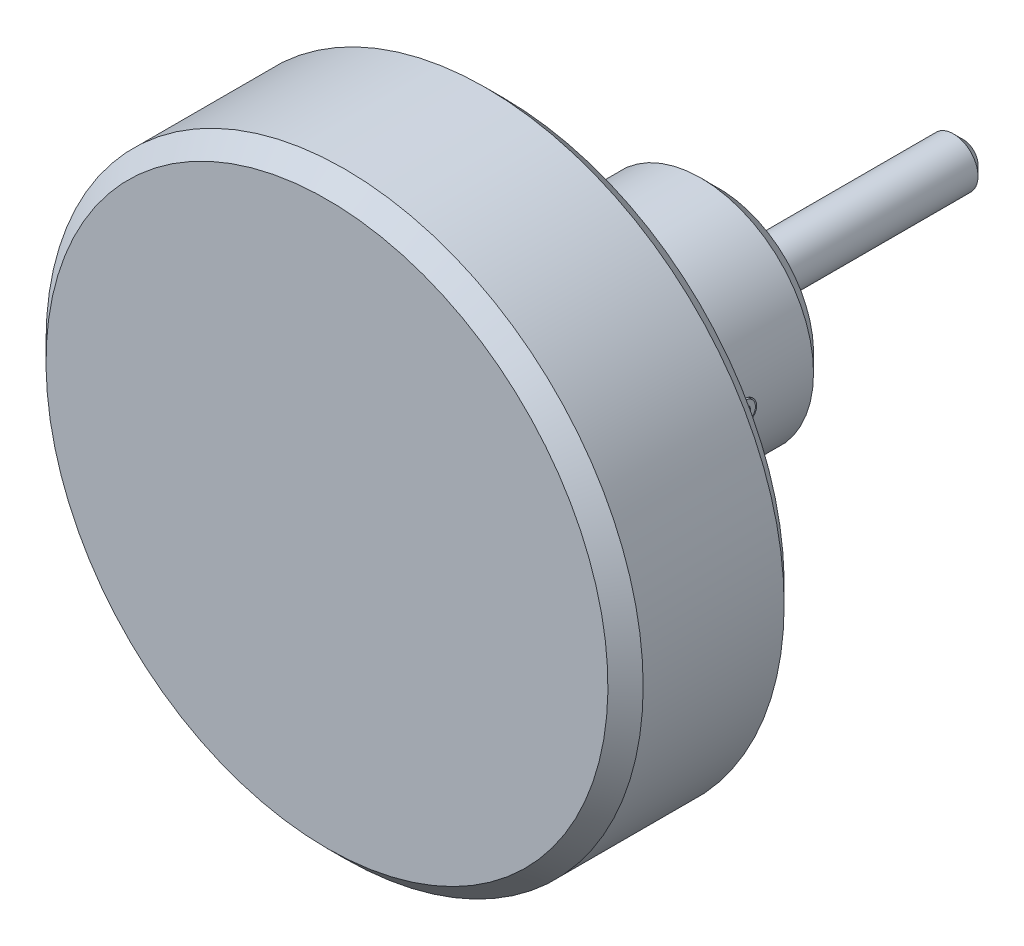
ISO-10303-21;
HEADER;
FILE_DESCRIPTION(('STEP AP214'),'2;1');
FILE_NAME('part.step','',(''),(''),'','','');
FILE_SCHEMA(('AUTOMOTIVE_DESIGN { 1 0 10303 214 1 1 1 1 }'));
ENDSEC;
DATA;
#1=APPLICATION_CONTEXT('core data for automotive mechanical design processes');
#2=APPLICATION_PROTOCOL_DEFINITION('international standard','automotive_design',2000,#1);
#3=PRODUCT_CONTEXT('',#1,'mechanical');
#4=PRODUCT('Part','Part','',(#3));
#5=PRODUCT_RELATED_PRODUCT_CATEGORY('part','',(#4));
#6=PRODUCT_DEFINITION_FORMATION('','',#4);
#7=PRODUCT_DEFINITION_CONTEXT('part definition',#1,'design');
#8=PRODUCT_DEFINITION('design','',#6,#7);
#9=PRODUCT_DEFINITION_SHAPE('','',#8);
#10=(LENGTH_UNIT() NAMED_UNIT(*) SI_UNIT(.MILLI.,.METRE.));
#11=(NAMED_UNIT(*) PLANE_ANGLE_UNIT() SI_UNIT($,.RADIAN.));
#12=(NAMED_UNIT(*) SI_UNIT($,.STERADIAN.) SOLID_ANGLE_UNIT());
#13=UNCERTAINTY_MEASURE_WITH_UNIT(LENGTH_MEASURE(1.E-05),#10,'distance_accuracy_value','');
#14=(GEOMETRIC_REPRESENTATION_CONTEXT(3) GLOBAL_UNCERTAINTY_ASSIGNED_CONTEXT((#13)) GLOBAL_UNIT_ASSIGNED_CONTEXT((#10,
#11,#12)) REPRESENTATION_CONTEXT('',''));
#15=CARTESIAN_POINT('',(0.,0.,0.));
#16=DIRECTION('',(0.,0.,1.));
#17=DIRECTION('',(1.,0.,0.));
#18=AXIS2_PLACEMENT_3D('',#15,#16,#17);
#19=CARTESIAN_POINT('',(11.5,-0.531816960175001,21.1323187565515));
#20=DIRECTION('',(1.,0.,0.));
#21=DIRECTION('',(0.,1.,0.));
#22=AXIS2_PLACEMENT_3D('',#19,#20,#21);
#23=PLANE('',#22);
#24=CARTESIAN_POINT('',(11.5,0.,21.3));
#25=DIRECTION('',(1.,0.,0.));
#26=DIRECTION('',(0.,1.,0.));
#27=AXIS2_PLACEMENT_3D('',#24,#25,#26);
#28=CIRCLE('',#27,1.06562557198734);
#29=CARTESIAN_POINT('',(11.5,-1.0163051711551,20.9795602104034));
#30=VERTEX_POINT('',#29);
#31=CARTESIAN_POINT('',(11.5,-1.0163051711551,21.6204397895966));
#32=VERTEX_POINT('',#31);
#33=EDGE_CURVE('E12',#30,#32,#28,.T.);
#34=ORIENTED_EDGE('',*,*,#33,.T.);
#35=DIRECTION('',(0.,-0.953716950748229,0.300705799504267));
#36=VECTOR('',#35,1.);
#37=CARTESIAN_POINT('',(11.5,-0.531816960174998,21.4676812434485));
#38=LINE('',#37,#36);
#39=CARTESIAN_POINT('',(11.5,-0.531816960174998,21.4676812434485));
#40=VERTEX_POINT('',#39);
#41=EDGE_CURVE('E111',#40,#32,#38,.T.);
#42=ORIENTED_EDGE('',*,*,#41,.F.);
#43=CARTESIAN_POINT('',(11.5,0.,21.3));
#44=DIRECTION('',(1.,0.,0.));
#45=DIRECTION('',(0.,1.,0.));
#46=AXIS2_PLACEMENT_3D('',#43,#44,#45);
#47=CIRCLE('',#46,0.557625571987339);
#48=CARTESIAN_POINT('',(11.5,-0.531816960175001,21.1323187565515));
#49=VERTEX_POINT('',#48);
#50=EDGE_CURVE('E62',#49,#40,#47,.T.);
#51=ORIENTED_EDGE('',*,*,#50,.F.);
#52=DIRECTION('',(0.,-0.953716950748229,-0.300705799504267));
#53=VECTOR('',#52,1.);
#54=CARTESIAN_POINT('',(11.5,-0.531816960175001,21.1323187565515));
#55=LINE('',#54,#53);
#56=EDGE_CURVE('E113',#49,#30,#55,.T.);
#57=ORIENTED_EDGE('',*,*,#56,.T.);
#58=EDGE_LOOP('',(#34,#42,#51,#57));
#59=FACE_BOUND('',#58,.T.);
#60=ADVANCED_FACE('F47',(#59),#23,.T.);
#61=CARTESIAN_POINT('',(11.5,0.,21.3));
#62=DIRECTION('',(-1.,0.,0.));
#63=DIRECTION('',(0.,-1.,0.));
#64=AXIS2_PLACEMENT_3D('',#61,#62,#63);
#65=CONICAL_SURFACE('',#64,1.06562557198734,0.0872664625997154);
#66=CARTESIAN_POINT('',(10.07125,0.,21.3));
#67=DIRECTION('',(1.,0.,0.));
#68=DIRECTION('',(0.,1.,0.));
#69=AXIS2_PLACEMENT_3D('',#66,#67,#68);
#70=CIRCLE('',#69,1.190625);
#71=CARTESIAN_POINT('',(10.07125,-1.13551924448461,20.9419721574652));
#72=VERTEX_POINT('',#71);
#73=CARTESIAN_POINT('',(10.07125,-1.13551924448461,21.6580278425348));
#74=VERTEX_POINT('',#73);
#75=EDGE_CURVE('E55',#72,#74,#70,.T.);
#76=ORIENTED_EDGE('',*,*,#75,.T.);
#77=DIRECTION('',(-0.996194698091746,-0.0831219092134939,0.0262082373043228));
#78=VECTOR('',#77,1.);
#79=CARTESIAN_POINT('',(11.5,-1.0163051711551,21.6204397895966));
#80=LINE('',#79,#78);
#81=EDGE_CURVE('E122',#32,#74,#80,.T.);
#82=ORIENTED_EDGE('',*,*,#81,.F.);
#83=ORIENTED_EDGE('',*,*,#33,.F.);
#84=DIRECTION('',(-0.996194698091746,-0.0831219092134939,-0.0262082373043228));
#85=VECTOR('',#84,1.);
#86=CARTESIAN_POINT('',(11.5,-1.0163051711551,20.9795602104034));
#87=LINE('',#86,#85);
#88=EDGE_CURVE('E144',#30,#72,#87,.T.);
#89=ORIENTED_EDGE('',*,*,#88,.T.);
#90=EDGE_LOOP('',(#76,#82,#83,#89));
#91=FACE_BOUND('',#90,.T.);
#92=ADVANCED_FACE('F49',(#91),#65,.T.);
#93=CARTESIAN_POINT('',(11.5,0.,21.3));
#94=DIRECTION('',(1.,0.,0.));
#95=DIRECTION('',(0.,1.,0.));
#96=AXIS2_PLACEMENT_3D('',#93,#94,#95);
#97=CYLINDRICAL_SURFACE('',#96,1.190625);
#98=CARTESIAN_POINT('',(3.40375,0.,21.3));
#99=DIRECTION('',(1.,0.,0.));
#100=DIRECTION('',(0.,1.,0.));
#101=AXIS2_PLACEMENT_3D('',#98,#99,#100);
#102=CIRCLE('',#101,1.190625);
#103=CARTESIAN_POINT('',(3.40375,-1.13551924448461,20.9419721574652));
#104=VERTEX_POINT('',#103);
#105=CARTESIAN_POINT('',(3.40375,-1.13551924448461,21.6580278425348));
#106=VERTEX_POINT('',#105);
#107=EDGE_CURVE('E170',#104,#106,#102,.T.);
#108=ORIENTED_EDGE('',*,*,#107,.T.);
#109=DIRECTION('',(-1.,0.,0.));
#110=VECTOR('',#109,1.);
#111=CARTESIAN_POINT('',(10.07125,-1.13551924448461,21.6580278425348));
#112=LINE('',#111,#110);
#113=EDGE_CURVE('E127',#74,#106,#112,.T.);
#114=ORIENTED_EDGE('',*,*,#113,.F.);
#115=ORIENTED_EDGE('',*,*,#75,.F.);
#116=DIRECTION('',(-1.,0.,0.));
#117=VECTOR('',#116,1.);
#118=CARTESIAN_POINT('',(10.07125,-1.13551924448461,20.9419721574652));
#119=LINE('',#118,#117);
#120=EDGE_CURVE('E146',#72,#104,#119,.T.);
#121=ORIENTED_EDGE('',*,*,#120,.T.);
#122=EDGE_LOOP('',(#108,#114,#115,#121));
#123=FACE_BOUND('',#122,.T.);
#124=ADVANCED_FACE('F172',(#123),#97,.T.);
#125=CARTESIAN_POINT('',(3.40375,0.,21.3));
#126=DIRECTION('',(1.,0.,0.));
#127=DIRECTION('',(0.,1.,0.));
#128=AXIS2_PLACEMENT_3D('',#125,#126,#127);
#129=CONICAL_SURFACE('',#128,1.190625,0.0872664625997158);
#130=CARTESIAN_POINT('',(1.975,0.,21.3));
#131=DIRECTION('',(1.,0.,0.));
#132=DIRECTION('',(0.,1.,0.));
#133=AXIS2_PLACEMENT_3D('',#130,#131,#132);
#134=CIRCLE('',#133,1.06562557198734);
#135=CARTESIAN_POINT('',(1.975,-1.0163051711551,20.9795602104034));
#136=VERTEX_POINT('',#135);
#137=CARTESIAN_POINT('',(1.975,-1.0163051711551,21.6204397895966));
#138=VERTEX_POINT('',#137);
#139=EDGE_CURVE('E168',#136,#138,#134,.T.);
#140=ORIENTED_EDGE('',*,*,#139,.T.);
#141=DIRECTION('',(-0.996194698091746,0.0831219092134933,-0.0262082373043227));
#142=VECTOR('',#141,1.);
#143=CARTESIAN_POINT('',(3.40375,-1.13551924448461,21.6580278425348));
#144=LINE('',#143,#142);
#145=EDGE_CURVE('E129',#106,#138,#144,.T.);
#146=ORIENTED_EDGE('',*,*,#145,.F.);
#147=ORIENTED_EDGE('',*,*,#107,.F.);
#148=DIRECTION('',(-0.996194698091746,0.0831219092134933,0.0262082373043227));
#149=VECTOR('',#148,1.);
#150=CARTESIAN_POINT('',(3.40375,-1.13551924448461,20.9419721574652));
#151=LINE('',#150,#149);
#152=EDGE_CURVE('E149',#104,#136,#151,.T.);
#153=ORIENTED_EDGE('',*,*,#152,.T.);
#154=EDGE_LOOP('',(#140,#146,#147,#153));
#155=FACE_BOUND('',#154,.T.);
#156=ADVANCED_FACE('F178',(#155),#129,.T.);
#157=CARTESIAN_POINT('',(1.975,-1.0163051711551,20.9795602104034));
#158=DIRECTION('',(-1.,0.,0.));
#159=DIRECTION('',(0.,-1.,0.));
#160=AXIS2_PLACEMENT_3D('',#157,#158,#159);
#161=PLANE('',#160);
#162=CARTESIAN_POINT('',(1.975,0.,21.3));
#163=DIRECTION('',(1.,0.,0.));
#164=DIRECTION('',(0.,1.,0.));
#165=AXIS2_PLACEMENT_3D('',#162,#163,#164);
#166=CIRCLE('',#165,0.557625571987339);
#167=CARTESIAN_POINT('',(1.975,-0.531816960175003,21.1323187565515));
#168=VERTEX_POINT('',#167);
#169=CARTESIAN_POINT('',(1.975,-0.531816960175,21.4676812434485));
#170=VERTEX_POINT('',#169);
#171=EDGE_CURVE('E166',#168,#170,#166,.T.);
#172=ORIENTED_EDGE('',*,*,#171,.T.);
#173=DIRECTION('',(0.,0.953716950748229,-0.300705799504267));
#174=VECTOR('',#173,1.);
#175=CARTESIAN_POINT('',(1.975,-1.0163051711551,21.6204397895966));
#176=LINE('',#175,#174);
#177=EDGE_CURVE('E134',#138,#170,#176,.T.);
#178=ORIENTED_EDGE('',*,*,#177,.F.);
#179=ORIENTED_EDGE('',*,*,#139,.F.);
#180=DIRECTION('',(0.,0.953716950748229,0.300705799504267));
#181=VECTOR('',#180,1.);
#182=CARTESIAN_POINT('',(1.975,-1.0163051711551,20.9795602104034));
#183=LINE('',#182,#181);
#184=EDGE_CURVE('E152',#136,#168,#183,.T.);
#185=ORIENTED_EDGE('',*,*,#184,.T.);
#186=EDGE_LOOP('',(#172,#178,#179,#185));
#187=FACE_BOUND('',#186,.T.);
#188=ADVANCED_FACE('F181',(#187),#161,.T.);
#189=CARTESIAN_POINT('',(1.975,0.,21.3));
#190=DIRECTION('',(1.,0.,0.));
#191=DIRECTION('',(0.,1.,0.));
#192=AXIS2_PLACEMENT_3D('',#189,#190,#191);
#193=CONICAL_SURFACE('',#192,0.557625571987339,0.0872664625997164);
#194=CARTESIAN_POINT('',(3.40374999999999,0.,21.3));
#195=DIRECTION('',(1.,0.,0.));
#196=DIRECTION('',(0.,1.,0.));
#197=AXIS2_PLACEMENT_3D('',#194,#195,#196);
#198=CIRCLE('',#197,0.682625000000002);
#199=CARTESIAN_POINT('',(3.40374999999999,-0.651031033504513,21.0947307036134));
#200=VERTEX_POINT('',#199);
#201=CARTESIAN_POINT('',(3.40374999999999,-0.65103103350451,21.5052692963866));
#202=VERTEX_POINT('',#201);
#203=EDGE_CURVE('E164',#200,#202,#198,.T.);
#204=ORIENTED_EDGE('',*,*,#203,.T.);
#205=DIRECTION('',(0.996194698091746,-0.0831219092134934,0.0262082373043227));
#206=VECTOR('',#205,1.);
#207=CARTESIAN_POINT('',(1.975,-0.531816960175,21.4676812434485));
#208=LINE('',#207,#206);
#209=EDGE_CURVE('E137',#170,#202,#208,.T.);
#210=ORIENTED_EDGE('',*,*,#209,.F.);
#211=ORIENTED_EDGE('',*,*,#171,.F.);
#212=DIRECTION('',(0.996194698091746,-0.0831219092134934,-0.0262082373043227));
#213=VECTOR('',#212,1.);
#214=CARTESIAN_POINT('',(1.975,-0.531816960175003,21.1323187565515));
#215=LINE('',#214,#213);
#216=EDGE_CURVE('E155',#168,#200,#215,.T.);
#217=ORIENTED_EDGE('',*,*,#216,.T.);
#218=EDGE_LOOP('',(#204,#210,#211,#217));
#219=FACE_BOUND('',#218,.T.);
#220=ADVANCED_FACE('F186',(#219),#193,.F.);
#221=CARTESIAN_POINT('',(11.5,0.,21.3));
#222=DIRECTION('',(1.,0.,0.));
#223=DIRECTION('',(0.,1.,0.));
#224=AXIS2_PLACEMENT_3D('',#221,#222,#223);
#225=CYLINDRICAL_SURFACE('',#224,0.682625000000002);
#226=CARTESIAN_POINT('',(10.07125,0.,21.3));
#227=DIRECTION('',(1.,0.,0.));
#228=DIRECTION('',(0.,1.,0.));
#229=AXIS2_PLACEMENT_3D('',#226,#227,#228);
#230=CIRCLE('',#229,0.682625000000001);
#231=CARTESIAN_POINT('',(10.07125,-0.651031033504512,21.0947307036134));
#232=VERTEX_POINT('',#231);
#233=CARTESIAN_POINT('',(10.07125,-0.651031033504508,21.5052692963866));
#234=VERTEX_POINT('',#233);
#235=EDGE_CURVE('E70',#232,#234,#230,.T.);
#236=ORIENTED_EDGE('',*,*,#235,.T.);
#237=DIRECTION('',(1.,0.,0.));
#238=VECTOR('',#237,1.);
#239=CARTESIAN_POINT('',(3.40374999999999,-0.65103103350451,21.5052692963866));
#240=LINE('',#239,#238);
#241=EDGE_CURVE('E140',#202,#234,#240,.T.);
#242=ORIENTED_EDGE('',*,*,#241,.F.);
#243=ORIENTED_EDGE('',*,*,#203,.F.);
#244=DIRECTION('',(1.,0.,0.));
#245=VECTOR('',#244,1.);
#246=CARTESIAN_POINT('',(3.40374999999999,-0.651031033504513,21.0947307036134));
#247=LINE('',#246,#245);
#248=EDGE_CURVE('E158',#200,#232,#247,.T.);
#249=ORIENTED_EDGE('',*,*,#248,.T.);
#250=EDGE_LOOP('',(#236,#242,#243,#249));
#251=FACE_BOUND('',#250,.T.);
#252=ADVANCED_FACE('F189',(#251),#225,.F.);
#253=CARTESIAN_POINT('',(10.07125,0.,21.3));
#254=DIRECTION('',(-1.,0.,0.));
#255=DIRECTION('',(0.,-1.,0.));
#256=AXIS2_PLACEMENT_3D('',#253,#254,#255);
#257=CONICAL_SURFACE('',#256,0.682625000000001,0.0872664625997159);
#258=DIRECTION('',(0.996194698091745,0.0831219092134938,0.0262082373043228));
#259=VECTOR('',#258,1.);
#260=CARTESIAN_POINT('',(10.07125,-0.651031033504512,21.0947307036134));
#261=LINE('',#260,#259);
#262=EDGE_CURVE('E160',#232,#49,#261,.T.);
#263=ORIENTED_EDGE('',*,*,#262,.T.);
#264=ORIENTED_EDGE('',*,*,#50,.T.);
#265=DIRECTION('',(0.996194698091745,0.0831219092134938,-0.0262082373043228));
#266=VECTOR('',#265,1.);
#267=CARTESIAN_POINT('',(10.07125,-0.651031033504508,21.5052692963866));
#268=LINE('',#267,#266);
#269=EDGE_CURVE('E125',#234,#40,#268,.T.);
#270=ORIENTED_EDGE('',*,*,#269,.F.);
#271=ORIENTED_EDGE('',*,*,#235,.F.);
#272=EDGE_LOOP('',(#263,#264,#270,#271));
#273=FACE_BOUND('',#272,.T.);
#274=ADVANCED_FACE('F191',(#273),#257,.F.);
#275=CARTESIAN_POINT('',(0.,0.,21.3));
#276=DIRECTION('',(0.,0.300705799504267,-0.953716950748229));
#277=DIRECTION('',(1.,0.,0.));
#278=AXIS2_PLACEMENT_3D('',#275,#276,#277);
#279=PLANE('',#278);
#280=ORIENTED_EDGE('',*,*,#56,.F.);
#281=ORIENTED_EDGE('',*,*,#262,.F.);
#282=ORIENTED_EDGE('',*,*,#248,.F.);
#283=ORIENTED_EDGE('',*,*,#216,.F.);
#284=ORIENTED_EDGE('',*,*,#184,.F.);
#285=ORIENTED_EDGE('',*,*,#152,.F.);
#286=ORIENTED_EDGE('',*,*,#120,.F.);
#287=ORIENTED_EDGE('',*,*,#88,.F.);
#288=EDGE_LOOP('',(#280,#281,#282,#283,#284,#285,#286,#287));
#289=FACE_BOUND('',#288,.T.);
#290=ADVANCED_FACE('F193',(#289),#279,.F.);
#291=CARTESIAN_POINT('',(0.,0.,21.3));
#292=DIRECTION('',(0.,-0.300705799504267,-0.953716950748229));
#293=DIRECTION('',(1.,0.,0.));
#294=AXIS2_PLACEMENT_3D('',#291,#292,#293);
#295=PLANE('',#294);
#296=ORIENTED_EDGE('',*,*,#41,.T.);
#297=ORIENTED_EDGE('',*,*,#81,.T.);
#298=ORIENTED_EDGE('',*,*,#113,.T.);
#299=ORIENTED_EDGE('',*,*,#145,.T.);
#300=ORIENTED_EDGE('',*,*,#177,.T.);
#301=ORIENTED_EDGE('',*,*,#209,.T.);
#302=ORIENTED_EDGE('',*,*,#241,.T.);
#303=ORIENTED_EDGE('',*,*,#269,.T.);
#304=EDGE_LOOP('',(#296,#297,#298,#299,#300,#301,#302,#303));
#305=FACE_BOUND('',#304,.T.);
#306=ADVANCED_FACE('F120',(#305),#295,.T.);
#307=CLOSED_SHELL('',(#60,#92,#124,#156,#188,#220,#252,#274,#290,#306));
#308=MANIFOLD_SOLID_BREP('B2',#307);
#309=CARTESIAN_POINT('',(0.,2.5,-12.5));
#310=DIRECTION('',(0.,0.,-1.));
#311=DIRECTION('',(-1.,0.,0.));
#312=AXIS2_PLACEMENT_3D('',#309,#310,#311);
#313=PLANE('',#312);
#314=CARTESIAN_POINT('',(0.,0.,-12.5));
#315=DIRECTION('',(0.,0.,-1.));
#316=DIRECTION('',(-1.,0.,0.));
#317=AXIS2_PLACEMENT_3D('',#314,#315,#316);
#318=CIRCLE('',#317,1.5);
#319=CARTESIAN_POINT('',(-1.5,0.,-12.5));
#320=VERTEX_POINT('',#319);
#321=EDGE_CURVE('E320',#320,#320,#318,.T.);
#322=ORIENTED_EDGE('',*,*,#321,.T.);
#323=EDGE_LOOP('',(#322));
#324=FACE_BOUND('',#323,.T.);
#325=ADVANCED_FACE('F275',(#324),#313,.T.);
#326=CARTESIAN_POINT('',(0.,0.,-12.5));
#327=DIRECTION('',(0.,0.,-1.));
#328=DIRECTION('',(-1.,0.,0.));
#329=AXIS2_PLACEMENT_3D('',#326,#327,#328);
#330=CYLINDRICAL_SURFACE('',#329,2.5);
#331=CARTESIAN_POINT('',(0.,0.,-11.5));
#332=DIRECTION('',(0.,0.,-1.));
#333=DIRECTION('',(-1.,0.,0.));
#334=AXIS2_PLACEMENT_3D('',#331,#332,#333);
#335=CIRCLE('',#334,2.5);
#336=CARTESIAN_POINT('',(-2.5,0.,-11.5));
#337=VERTEX_POINT('',#336);
#338=EDGE_CURVE('E316',#337,#337,#335,.F.);
#339=ORIENTED_EDGE('',*,*,#338,.T.);
#340=EDGE_LOOP('',(#339));
#341=FACE_BOUND('',#340,.T.);
#342=CARTESIAN_POINT('',(0.,0.,12.5));
#343=DIRECTION('',(0.,0.,-1.));
#344=DIRECTION('',(0.,1.,0.));
#345=AXIS2_PLACEMENT_3D('',#342,#343,#344);
#346=CIRCLE('',#345,2.5);
#347=CARTESIAN_POINT('',(0.,2.5,12.5));
#348=VERTEX_POINT('',#347);
#349=EDGE_CURVE('E324',#348,#348,#346,.F.);
#350=ORIENTED_EDGE('',*,*,#349,.F.);
#351=EDGE_LOOP('',(#350));
#352=FACE_BOUND('',#351,.T.);
#353=ADVANCED_FACE('F351',(#341,#352),#330,.T.);
#354=CARTESIAN_POINT('',(0.,11.5,12.5));
#355=DIRECTION('',(0.,0.,-1.));
#356=DIRECTION('',(0.,1.,0.));
#357=AXIS2_PLACEMENT_3D('',#354,#355,#356);
#358=PLANE('',#357);
#359=CARTESIAN_POINT('',(0.,0.,12.5));
#360=DIRECTION('',(0.,0.,-1.));
#361=DIRECTION('',(0.,1.,0.));
#362=AXIS2_PLACEMENT_3D('',#359,#360,#361);
#363=CIRCLE('',#362,9.7);
#364=CARTESIAN_POINT('',(0.,-9.7,12.5));
#365=VERTEX_POINT('',#364);
#366=EDGE_CURVE('E293',#365,#365,#363,.T.);
#367=ORIENTED_EDGE('',*,*,#366,.T.);
#368=EDGE_LOOP('',(#367));
#369=FACE_BOUND('',#368,.T.);
#370=ORIENTED_EDGE('',*,*,#349,.T.);
#371=EDGE_LOOP('',(#370));
#372=FACE_BOUND('',#371,.T.);
#373=ADVANCED_FACE('F357',(#369,#372),#358,.T.);
#374=CARTESIAN_POINT('',(0.,0.,12.5));
#375=DIRECTION('',(0.,0.,-1.));
#376=DIRECTION('',(0.,1.,0.));
#377=AXIS2_PLACEMENT_3D('',#374,#375,#376);
#378=CYLINDRICAL_SURFACE('',#377,11.5);
#379=CARTESIAN_POINT('',(11.4381996882978,1.190625,21.3));
#380=CARTESIAN_POINT('',(11.4382004959922,1.19062211760119,21.3666853587133));
#381=CARTESIAN_POINT('',(11.4387891439756,1.18500368641902,21.4334145018516));
#382=CARTESIAN_POINT('',(11.4410797355871,1.16267603767484,21.5650218054761));
#383=CARTESIAN_POINT('',(11.4427828979567,1.14595467856651,21.6298978584283));
#384=CARTESIAN_POINT('',(11.4471075783246,1.10191408703225,21.7558741052579));
#385=CARTESIAN_POINT('',(11.4497285309768,1.07460137762141,21.8169765964022));
#386=CARTESIAN_POINT('',(11.4555927828807,1.01016611816152,21.9337171295066));
#387=CARTESIAN_POINT('',(11.4588359607065,0.973045481576491,21.9893562344374));
#388=CARTESIAN_POINT('',(11.4655933591802,0.88989314946558,22.0938198409891));
#389=CARTESIAN_POINT('',(11.4691084785333,0.84383107571082,22.1426201060144));
#390=CARTESIAN_POINT('',(11.4760055476343,0.744168398281933,22.231811981477));
#391=CARTESIAN_POINT('',(11.4793874912172,0.690567446134137,22.2722032030044));
#392=CARTESIAN_POINT('',(11.4856460813656,0.577199489923253,22.3435146790163));
#393=CARTESIAN_POINT('',(11.4885215734459,0.517418878523723,22.3744134110771));
#394=CARTESIAN_POINT('',(11.4934334760168,0.393482930455823,22.4257250974975));
#395=CARTESIAN_POINT('',(11.4954699083212,0.329327707568708,22.4461383244617));
#396=CARTESIAN_POINT('',(11.4984679293004,0.198709024952377,22.4758282623311));
#397=CARTESIAN_POINT('',(11.4994333663788,0.132254720330633,22.485144855684));
#398=CARTESIAN_POINT('',(11.5001937139432,-0.0012808061482178,22.4925004913592));
#399=CARTESIAN_POINT('',(11.4999886567923,-0.068362010620952,22.4905398454862));
#400=CARTESIAN_POINT('',(11.4984342654673,-0.200976328459574,22.4754289804701));
#401=CARTESIAN_POINT('',(11.4970893170571,-0.266514387164956,22.4623216478651));
#402=CARTESIAN_POINT('',(11.4934113064543,-0.394455416172642,22.425356319328));
#403=CARTESIAN_POINT('',(11.4910782306393,-0.456858343240605,22.4014981751844));
#404=CARTESIAN_POINT('',(11.485678699555,-0.57689259338639,22.3436616276211));
#405=CARTESIAN_POINT('',(11.482610875045,-0.63451473404309,22.3096642999728));
#406=CARTESIAN_POINT('',(11.4760859543343,-0.743251537439305,22.2325281888615));
#407=CARTESIAN_POINT('',(11.4726288458922,-0.79436599543184,22.1893891178915));
#408=CARTESIAN_POINT('',(11.4656940406477,-0.888887773406571,22.0949530113426));
#409=CARTESIAN_POINT('',(11.4622163233356,-0.932257817911202,22.0436186593671));
#410=CARTESIAN_POINT('',(11.4556484194516,-1.00977092424771,21.9343784114312));
#411=CARTESIAN_POINT('',(11.4525582335102,-1.04391397106614,21.8764725047782));
#412=CARTESIAN_POINT('',(11.4471150406279,-1.10200400029421,21.7557036540468));
#413=CARTESIAN_POINT('',(11.444762206514,-1.1259485927694,21.692839552137));
#414=CARTESIAN_POINT('',(11.4410636547268,-1.16293206296689,21.563953342403));
#415=CARTESIAN_POINT('',(11.4397179041142,-1.17597129737877,21.4979313379413));
#416=CARTESIAN_POINT('',(11.4381916356308,-1.19072578563719,21.3649309366089));
#417=CARTESIAN_POINT('',(11.4380057477343,-1.19249322737901,21.2979583883746));
#418=CARTESIAN_POINT('',(11.4388060765652,-1.18479109807377,21.1646705868073));
#419=CARTESIAN_POINT('',(11.4397922762944,-1.17532168998778,21.0983553239562));
#420=CARTESIAN_POINT('',(11.4428207730047,-1.14545836187966,20.9684172057783));
#421=CARTESIAN_POINT('',(11.4448606767555,-1.12508919423605,20.904788601134));
#422=CARTESIAN_POINT('',(11.4497647938073,-1.07402984941507,20.7818511225432));
#423=CARTESIAN_POINT('',(11.4526290273023,-1.0433394193895,20.7225423544665));
#424=CARTESIAN_POINT('',(11.4588720584577,-0.972378313614911,20.6096904577886));
#425=CARTESIAN_POINT('',(11.4622526949469,-0.932073101050263,20.5561691491999));
#426=CARTESIAN_POINT('',(11.4691416326696,-0.843075961473601,20.4566328895072));
#427=CARTESIAN_POINT('',(11.4726499372908,-0.794383811786568,20.410618137767));
#428=CARTESIAN_POINT('',(11.4794151606875,-0.689768383325761,20.3272207818841));
#429=CARTESIAN_POINT('',(11.4826710546309,-0.633817863484264,20.2898722547631));
#430=CARTESIAN_POINT('',(11.4885496352162,-0.51640820993032,20.2251021956229));
#431=CARTESIAN_POINT('',(11.4911723310738,-0.454949156408359,20.1976805191227));
#432=CARTESIAN_POINT('',(11.4954843904742,-0.328385250590518,20.1536001150665));
#433=CARTESIAN_POINT('',(11.4971755280403,-0.263287589873158,20.1369209196199));
#434=CARTESIAN_POINT('',(11.4994412160231,-0.131197298323004,20.1147321648876));
#435=CARTESIAN_POINT('',(11.5000158002377,-0.0642047249111862,20.1092222675088));
#436=CARTESIAN_POINT('',(11.499983606137,0.0694392613761783,20.1095334656367));
#437=CARTESIAN_POINT('',(11.4993823384194,0.136090804943405,20.1153017064348));
#438=CARTESIAN_POINT('',(11.4970768812158,0.267472523233119,20.1378944665163));
#439=CARTESIAN_POINT('',(11.4953726910396,0.332202696753086,20.1547189927193));
#440=CARTESIAN_POINT('',(11.4910522821915,0.457902960110669,20.1989318328341));
#441=CARTESIAN_POINT('',(11.4884362082823,0.518873644964754,20.226318470071));
#442=CARTESIAN_POINT('',(11.4825833981232,0.635361272261069,20.2908725328397));
#443=CARTESIAN_POINT('',(11.4793466640704,0.690878234007777,20.3280399237488));
#444=CARTESIAN_POINT('',(11.4725968347056,0.795153302703373,20.4112983860991));
#445=CARTESIAN_POINT('',(11.469082562297,0.843879899508353,20.4574288272381));
#446=CARTESIAN_POINT('',(11.4621836355438,0.932923569322518,20.5572254705206));
#447=CARTESIAN_POINT('',(11.4587990124466,0.973238625312344,20.6108934749605));
#448=CARTESIAN_POINT('',(11.4525328098381,1.04440211605392,20.724402036625));
#449=CARTESIAN_POINT('',(11.4496526161848,1.07522464192582,20.7842589019739));
#450=CARTESIAN_POINT('',(11.4447378388911,1.12633973677049,20.9082908980516));
#451=CARTESIAN_POINT('',(11.4427023063106,1.14664412881757,20.9724610882144));
#452=CARTESIAN_POINT('',(11.4402182339874,1.17110895246458,21.0808256848847));
#453=CARTESIAN_POINT('',(11.4394648830036,1.17841740268938,21.1243283775751));
#454=CARTESIAN_POINT('',(11.438455344416,1.18817636773638,21.2118810079553));
#455=CARTESIAN_POINT('',(11.4381991545324,1.19062690483488,21.2559309431347));
#456=CARTESIAN_POINT('',(11.4381996882978,1.190625,21.3));
#457=B_SPLINE_CURVE_WITH_KNOTS('',3,(#379,#380,#381,#382,#383,#384,#385,#386,#387,#388,#389,
#390,#391,#392,#393,#394,#395,#396,#397,#398,#399,#400,#401,#402,#403,#404,#405,#406,#407,#408,
#409,#410,#411,#412,#413,#414,#415,#416,#417,#418,#419,#420,#421,#422,#423,#424,#425,#426,#427,
#428,#429,#430,#431,#432,#433,#434,#435,#436,#437,#438,#439,#440,#441,#442,#443,#444,#445,#446,
#447,#448,#449,#450,#451,#452,#453,#454,#455,#456),.UNSPECIFIED.,.T.,.F.,(4,2,2,2,2,2,2,2,2,2,2,
2,2,2,2,2,2,2,2,2,2,2,2,2,2,2,2,2,2,2,2,2,2,2,2,2,2,2,4),(0.,0.199895136512598,
0.400009228062109,0.600000268318609,0.799952320371739,1.0005959837591,1.20124892465735,
1.40235350652709,1.60345285977017,1.80382723890183,2.00419607790303,2.20379747363386,
2.4034016211685,2.60338067556971,2.80336602022764,3.00428941051485,3.20521312772702,
3.40618390409569,3.60714810690795,3.80718117482648,4.00721134182495,4.20678917407578,
4.40637189589998,4.6066826209305,4.80699866507466,5.0080895189449,5.20917744591007,
5.40988109314953,5.61057866502792,5.81033792702184,6.01009731403573,6.20982500343025,
6.40955198582561,6.61017694381538,6.81084995489512,7.01206592494778,7.21305522152248,
7.34515664083699,7.47725745438966),.UNSPECIFIED.);
#458=CARTESIAN_POINT('',(11.4381996882978,1.190625,21.3));
#459=VERTEX_POINT('',#458);
#460=EDGE_CURVE('E46',#459,#459,#457,.T.);
#461=ORIENTED_EDGE('',*,*,#460,.F.);
#462=EDGE_LOOP('',(#461));
#463=FACE_BOUND('',#462,.T.);
#464=CARTESIAN_POINT('',(0.,0.,14.3));
#465=DIRECTION('',(0.,0.,-1.));
#466=DIRECTION('',(0.,1.,0.));
#467=AXIS2_PLACEMENT_3D('',#464,#465,#466);
#468=CIRCLE('',#467,11.5);
#469=CARTESIAN_POINT('',(0.,-11.5,14.3));
#470=VERTEX_POINT('',#469);
#471=EDGE_CURVE('E288',#470,#470,#468,.F.);
#472=ORIENTED_EDGE('',*,*,#471,.T.);
#473=EDGE_LOOP('',(#472));
#474=FACE_BOUND('',#473,.T.);
#475=CARTESIAN_POINT('',(0.,0.,34.5));
#476=DIRECTION('',(0.,0.,-1.));
#477=DIRECTION('',(0.,1.,0.));
#478=AXIS2_PLACEMENT_3D('',#475,#476,#477);
#479=CIRCLE('',#478,11.5);
#480=CARTESIAN_POINT('',(0.,11.5,34.5));
#481=VERTEX_POINT('',#480);
#482=EDGE_CURVE('E328',#481,#481,#479,.T.);
#483=ORIENTED_EDGE('',*,*,#482,.T.);
#484=EDGE_LOOP('',(#483));
#485=FACE_BOUND('',#484,.T.);
#486=ADVANCED_FACE('F388',(#463,#474,#485),#378,.T.);
#487=CARTESIAN_POINT('',(0.,11.5,34.5));
#488=DIRECTION('',(0.,0.,-1.));
#489=DIRECTION('',(0.,1.,0.));
#490=AXIS2_PLACEMENT_3D('',#487,#488,#489);
#491=PLANE('',#490);
#492=CARTESIAN_POINT('',(0.,0.,34.5));
#493=DIRECTION('',(0.,0.,-1.));
#494=DIRECTION('',(0.,1.,0.));
#495=AXIS2_PLACEMENT_3D('',#492,#493,#494);
#496=CIRCLE('',#495,28.6999999999999);
#497=CARTESIAN_POINT('',(0.,28.6999999999999,34.5));
#498=VERTEX_POINT('',#497);
#499=EDGE_CURVE('E312',#498,#498,#496,.T.);
#500=ORIENTED_EDGE('',*,*,#499,.T.);
#501=EDGE_LOOP('',(#500));
#502=FACE_BOUND('',#501,.T.);
#503=ORIENTED_EDGE('',*,*,#482,.F.);
#504=EDGE_LOOP('',(#503));
#505=FACE_BOUND('',#504,.T.);
#506=ADVANCED_FACE('F380',(#502,#505),#491,.T.);
#507=CARTESIAN_POINT('',(0.,0.,12.5));
#508=DIRECTION('',(0.,0.,-1.));
#509=DIRECTION('',(0.,1.,0.));
#510=AXIS2_PLACEMENT_3D('',#507,#508,#509);
#511=CYLINDRICAL_SURFACE('',#510,30.5);
#512=CARTESIAN_POINT('',(0.,0.,36.3));
#513=DIRECTION('',(0.,0.,-1.));
#514=DIRECTION('',(0.,1.,0.));
#515=AXIS2_PLACEMENT_3D('',#512,#513,#514);
#516=CIRCLE('',#515,30.5);
#517=CARTESIAN_POINT('',(0.,30.5,36.3));
#518=VERTEX_POINT('',#517);
#519=EDGE_CURVE('E304',#518,#518,#516,.F.);
#520=ORIENTED_EDGE('',*,*,#519,.T.);
#521=EDGE_LOOP('',(#520));
#522=FACE_BOUND('',#521,.T.);
#523=CARTESIAN_POINT('',(0.,0.,50.7));
#524=DIRECTION('',(0.,0.,1.));
#525=DIRECTION('',(0.,-1.,0.));
#526=AXIS2_PLACEMENT_3D('',#523,#524,#525);
#527=CIRCLE('',#526,30.5);
#528=CARTESIAN_POINT('',(0.,-30.5,50.7));
#529=VERTEX_POINT('',#528);
#530=EDGE_CURVE('E308',#529,#529,#527,.F.);
#531=ORIENTED_EDGE('',*,*,#530,.T.);
#532=EDGE_LOOP('',(#531));
#533=FACE_BOUND('',#532,.T.);
#534=ADVANCED_FACE('F378',(#522,#533),#511,.T.);
#535=CARTESIAN_POINT('',(0.,30.5,52.5));
#536=DIRECTION('',(0.,0.,1.));
#537=DIRECTION('',(0.,-1.,0.));
#538=AXIS2_PLACEMENT_3D('',#535,#536,#537);
#539=PLANE('',#538);
#540=CARTESIAN_POINT('',(0.,0.,52.5));
#541=DIRECTION('',(0.,0.,1.));
#542=DIRECTION('',(0.,-1.,0.));
#543=AXIS2_PLACEMENT_3D('',#540,#541,#542);
#544=CIRCLE('',#543,28.7);
#545=CARTESIAN_POINT('',(0.,-28.7,52.5));
#546=VERTEX_POINT('',#545);
#547=EDGE_CURVE('E298',#546,#546,#544,.T.);
#548=ORIENTED_EDGE('',*,*,#547,.T.);
#549=EDGE_LOOP('',(#548));
#550=FACE_BOUND('',#549,.T.);
#551=ADVANCED_FACE('F366',(#550),#539,.T.);
#552=CARTESIAN_POINT('',(0.,0.,-12.5));
#553=DIRECTION('',(0.,0.,1.));
#554=DIRECTION('',(1.,0.,0.));
#555=AXIS2_PLACEMENT_3D('',#552,#553,#554);
#556=CONICAL_SURFACE('',#555,1.5,0.785398163397451);
#557=ORIENTED_EDGE('',*,*,#338,.F.);
#558=EDGE_LOOP('',(#557));
#559=FACE_BOUND('',#558,.T.);
#560=ORIENTED_EDGE('',*,*,#321,.F.);
#561=EDGE_LOOP('',(#560));
#562=FACE_BOUND('',#561,.T.);
#563=ADVANCED_FACE('F362',(#559,#562),#556,.T.);
#564=CARTESIAN_POINT('',(0.,0.,34.5));
#565=DIRECTION('',(0.,0.,1.));
#566=DIRECTION('',(0.,-1.,0.));
#567=AXIS2_PLACEMENT_3D('',#564,#565,#566);
#568=CONICAL_SURFACE('',#567,28.6999999999999,0.78539816339745);
#569=ORIENTED_EDGE('',*,*,#519,.F.);
#570=EDGE_LOOP('',(#569));
#571=FACE_BOUND('',#570,.T.);
#572=ORIENTED_EDGE('',*,*,#499,.F.);
#573=EDGE_LOOP('',(#572));
#574=FACE_BOUND('',#573,.T.);
#575=ADVANCED_FACE('F365',(#571,#574),#568,.T.);
#576=CARTESIAN_POINT('',(0.,0.,50.7));
#577=DIRECTION('',(0.,0.,-1.));
#578=DIRECTION('',(0.,1.,0.));
#579=AXIS2_PLACEMENT_3D('',#576,#577,#578);
#580=CONICAL_SURFACE('',#579,30.5,0.785398163397451);
#581=ORIENTED_EDGE('',*,*,#547,.F.);
#582=EDGE_LOOP('',(#581));
#583=FACE_BOUND('',#582,.T.);
#584=ORIENTED_EDGE('',*,*,#530,.F.);
#585=EDGE_LOOP('',(#584));
#586=FACE_BOUND('',#585,.T.);
#587=ADVANCED_FACE('F346',(#583,#586),#580,.T.);
#588=CARTESIAN_POINT('',(0.,0.,12.5));
#589=DIRECTION('',(0.,0.,1.));
#590=DIRECTION('',(0.,-1.,0.));
#591=AXIS2_PLACEMENT_3D('',#588,#589,#590);
#592=CONICAL_SURFACE('',#591,9.7,0.785398163397446);
#593=CARTESIAN_POINT('',(0.,-11.5,14.3));
#594=CARTESIAN_POINT('',(0.,-11.48125,14.28125));
#595=CARTESIAN_POINT('',(0.,-11.4625,14.2625));
#596=CARTESIAN_POINT('',(0.,-11.425,14.225));
#597=CARTESIAN_POINT('',(0.,-11.40625,14.20625));
#598=CARTESIAN_POINT('',(0.,-11.36875,14.16875));
#599=CARTESIAN_POINT('',(0.,-11.35,14.15));
#600=CARTESIAN_POINT('',(0.,-11.3125,14.1125));
#601=CARTESIAN_POINT('',(0.,-11.29375,14.09375));
#602=CARTESIAN_POINT('',(0.,-11.25625,14.05625));
#603=CARTESIAN_POINT('',(0.,-11.2375,14.0375));
#604=CARTESIAN_POINT('',(0.,-11.2,14.));
#605=CARTESIAN_POINT('',(0.,-11.18125,13.98125));
#606=CARTESIAN_POINT('',(0.,-11.14375,13.94375));
#607=CARTESIAN_POINT('',(0.,-11.125,13.925));
#608=CARTESIAN_POINT('',(0.,-11.0875,13.8875));
#609=CARTESIAN_POINT('',(0.,-11.06875,13.86875));
#610=CARTESIAN_POINT('',(0.,-11.03125,13.83125));
#611=CARTESIAN_POINT('',(0.,-11.0125,13.8125));
#612=CARTESIAN_POINT('',(0.,-10.975,13.775));
#613=CARTESIAN_POINT('',(0.,-10.95625,13.75625));
#614=CARTESIAN_POINT('',(0.,-10.91875,13.71875));
#615=CARTESIAN_POINT('',(0.,-10.9,13.7));
#616=CARTESIAN_POINT('',(0.,-10.8625,13.6625));
#617=CARTESIAN_POINT('',(0.,-10.84375,13.64375));
#618=CARTESIAN_POINT('',(0.,-10.80625,13.60625));
#619=CARTESIAN_POINT('',(0.,-10.7875,13.5875));
#620=CARTESIAN_POINT('',(0.,-10.75,13.55));
#621=CARTESIAN_POINT('',(0.,-10.73125,13.53125));
#622=CARTESIAN_POINT('',(0.,-10.69375,13.49375));
#623=CARTESIAN_POINT('',(0.,-10.675,13.475));
#624=CARTESIAN_POINT('',(0.,-10.6375,13.4375));
#625=CARTESIAN_POINT('',(0.,-10.61875,13.41875));
#626=CARTESIAN_POINT('',(0.,-10.58125,13.38125));
#627=CARTESIAN_POINT('',(0.,-10.5625,13.3625));
#628=CARTESIAN_POINT('',(0.,-10.525,13.325));
#629=CARTESIAN_POINT('',(0.,-10.50625,13.30625));
#630=CARTESIAN_POINT('',(0.,-10.46875,13.26875));
#631=CARTESIAN_POINT('',(0.,-10.45,13.25));
#632=CARTESIAN_POINT('',(0.,-10.4125,13.2125));
#633=CARTESIAN_POINT('',(0.,-10.39375,13.19375));
#634=CARTESIAN_POINT('',(0.,-10.35625,13.15625));
#635=CARTESIAN_POINT('',(0.,-10.3375,13.1375));
#636=CARTESIAN_POINT('',(0.,-10.3,13.1));
#637=CARTESIAN_POINT('',(0.,-10.28125,13.08125));
#638=CARTESIAN_POINT('',(0.,-10.24375,13.04375));
#639=CARTESIAN_POINT('',(0.,-10.225,13.025));
#640=CARTESIAN_POINT('',(0.,-10.1875,12.9875));
#641=CARTESIAN_POINT('',(0.,-10.16875,12.96875));
#642=CARTESIAN_POINT('',(0.,-10.13125,12.93125));
#643=CARTESIAN_POINT('',(0.,-10.1125,12.9125));
#644=CARTESIAN_POINT('',(0.,-10.075,12.875));
#645=CARTESIAN_POINT('',(0.,-10.05625,12.85625));
#646=CARTESIAN_POINT('',(0.,-10.01875,12.81875));
#647=CARTESIAN_POINT('',(0.,-10.,12.8));
#648=CARTESIAN_POINT('',(0.,-9.9625,12.7625));
#649=CARTESIAN_POINT('',(0.,-9.94375,12.74375));
#650=CARTESIAN_POINT('',(0.,-9.90625,12.70625));
#651=CARTESIAN_POINT('',(0.,-9.8875,12.6875));
#652=CARTESIAN_POINT('',(0.,-9.85,12.65));
#653=CARTESIAN_POINT('',(0.,-9.83125,12.63125));
#654=CARTESIAN_POINT('',(0.,-9.79375,12.59375));
#655=CARTESIAN_POINT('',(0.,-9.775,12.575));
#656=CARTESIAN_POINT('',(0.,-9.7375,12.5375));
#657=CARTESIAN_POINT('',(0.,-9.71875,12.51875));
#658=CARTESIAN_POINT('',(0.,-9.7,12.5));
#659=B_SPLINE_CURVE_WITH_KNOTS('',3,(#593,#594,#595,#596,#597,#598,#599,#600,#601,#602,#603,
#604,#605,#606,#607,#608,#609,#610,#611,#612,#613,#614,#615,#616,#617,#618,#619,#620,#621,#622,
#623,#624,#625,#626,#627,#628,#629,#630,#631,#632,#633,#634,#635,#636,#637,#638,#639,#640,#641,
#642,#643,#644,#645,#646,#647,#648,#649,#650,#651,#652,#653,#654,#655,#656,#657,#658),
.UNSPECIFIED.,.F.,.F.,(4,2,2,2,2,2,2,2,2,2,2,2,2,2,2,2,2,2,2,2,2,2,2,2,2,2,2,2,2,2,2,2,4),(0.,
0.0795495128834876,0.159099025766974,0.23864853865046,0.318198051533947,0.397747564417435,
0.47729707730092,0.556846590184408,0.636396103067894,0.71594561595138,0.795495128834867,
0.875044641718354,0.954594154601839,1.03414366748533,1.11369318036881,1.1932426932523,
1.27279220613579,1.35234171901927,1.43189123190276,1.51144074478625,1.59099025766973,
1.67053977055322,1.75008928343671,1.82963879632019,1.90918830920368,1.98873782208717,
2.06828733497065,2.14783684785414,2.22738636073763,2.30693587362111,2.3864853865046,
2.46603489938809,2.54558441227157),.UNSPECIFIED.);
#660=EDGE_CURVE('BSEAM277',#470,#365,#659,.T.);
#661=ORIENTED_EDGE('',*,*,#471,.F.);
#662=ORIENTED_EDGE('',*,*,#366,.F.);
#663=ORIENTED_EDGE('',*,*,#660,.T.);
#664=ORIENTED_EDGE('',*,*,#660,.F.);
#665=EDGE_LOOP('',(#661,#663,#662,#664));
#666=FACE_BOUND('',#665,.T.);
#667=ADVANCED_FACE('F277',(#666),#592,.T.);
#668=CARTESIAN_POINT('',(11.5,0.,21.3));
#669=DIRECTION('',(1.,0.,0.));
#670=DIRECTION('',(0.,1.,0.));
#671=AXIS2_PLACEMENT_3D('',#668,#669,#670);
#672=CYLINDRICAL_SURFACE('',#671,1.190625);
#673=ORIENTED_EDGE('',*,*,#460,.T.);
#674=EDGE_LOOP('',(#673));
#675=FACE_BOUND('',#674,.T.);
#676=CARTESIAN_POINT('',(1.975,0.,21.3));
#677=DIRECTION('',(1.,0.,0.));
#678=DIRECTION('',(0.,1.,0.));
#679=AXIS2_PLACEMENT_3D('',#676,#677,#678);
#680=CIRCLE('',#679,1.190625);
#681=CARTESIAN_POINT('',(1.975,1.190625,21.3));
#682=VERTEX_POINT('',#681);
#683=EDGE_CURVE('E332',#682,#682,#680,.T.);
#684=ORIENTED_EDGE('',*,*,#683,.F.);
#685=EDGE_LOOP('',(#684));
#686=FACE_BOUND('',#685,.T.);
#687=ADVANCED_FACE('F339',(#675,#686),#672,.F.);
#688=CARTESIAN_POINT('',(1.975,1.190625,21.3));
#689=DIRECTION('',(-1.,0.,0.));
#690=DIRECTION('',(0.,-1.,0.));
#691=AXIS2_PLACEMENT_3D('',#688,#689,#690);
#692=PLANE('',#691);
#693=ORIENTED_EDGE('',*,*,#683,.T.);
#694=EDGE_LOOP('',(#693));
#695=FACE_BOUND('',#694,.T.);
#696=ADVANCED_FACE('F337',(#695),#692,.F.);
#697=CLOSED_SHELL('',(#325,#353,#373,#486,#506,#534,#551,#563,#575,#587,#667,#687,#696));
#698=MANIFOLD_SOLID_BREP('B6',#697);
#699=ADVANCED_BREP_SHAPE_REPRESENTATION('',(#18,#308,#698),#14);
#700=SHAPE_DEFINITION_REPRESENTATION(#9,#699);
ENDSEC;
END-ISO-10303-21;
